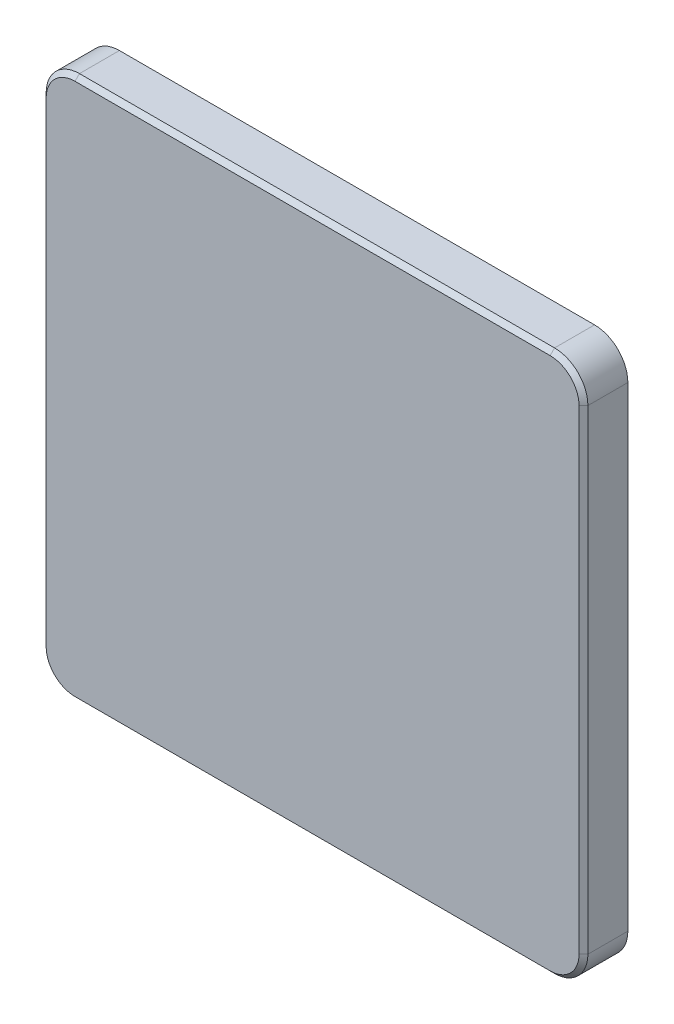
ISO-10303-21;
HEADER;
FILE_DESCRIPTION(('STEP AP214'),'2;1');
FILE_NAME('part.step','',(''),(''),'','','');
FILE_SCHEMA(('AUTOMOTIVE_DESIGN { 1 0 10303 214 1 1 1 1 }'));
ENDSEC;
DATA;
#1=APPLICATION_CONTEXT('core data for automotive mechanical design processes');
#2=APPLICATION_PROTOCOL_DEFINITION('international standard','automotive_design',2000,#1);
#3=PRODUCT_CONTEXT('',#1,'mechanical');
#4=PRODUCT('Part','Part','',(#3));
#5=PRODUCT_RELATED_PRODUCT_CATEGORY('part','',(#4));
#6=PRODUCT_DEFINITION_FORMATION('','',#4);
#7=PRODUCT_DEFINITION_CONTEXT('part definition',#1,'design');
#8=PRODUCT_DEFINITION('design','',#6,#7);
#9=PRODUCT_DEFINITION_SHAPE('','',#8);
#10=(LENGTH_UNIT() NAMED_UNIT(*) SI_UNIT(.MILLI.,.METRE.));
#11=(NAMED_UNIT(*) PLANE_ANGLE_UNIT() SI_UNIT($,.RADIAN.));
#12=(NAMED_UNIT(*) SI_UNIT($,.STERADIAN.) SOLID_ANGLE_UNIT());
#13=UNCERTAINTY_MEASURE_WITH_UNIT(LENGTH_MEASURE(1.E-05),#10,'distance_accuracy_value','');
#14=(GEOMETRIC_REPRESENTATION_CONTEXT(3) GLOBAL_UNCERTAINTY_ASSIGNED_CONTEXT((#13)) GLOBAL_UNIT_ASSIGNED_CONTEXT((#10,
#11,#12)) REPRESENTATION_CONTEXT('',''));
#15=CARTESIAN_POINT('',(0.,0.,0.));
#16=DIRECTION('',(0.,0.,1.));
#17=DIRECTION('',(1.,0.,0.));
#18=AXIS2_PLACEMENT_3D('',#15,#16,#17);
#19=CARTESIAN_POINT('',(2.7178,2.7178,-0.0253999999999999));
#20=DIRECTION('',(0.,0.,-1.));
#21=DIRECTION('',(0.,1.,0.));
#22=AXIS2_PLACEMENT_3D('',#19,#20,#21);
#23=CONICAL_SURFACE('',#22,0.3556,0.785398163400003);
#24=DIRECTION('',(0.,-0.707106781186551,0.707106781186544));
#25=VECTOR('',#24,1.);
#26=CARTESIAN_POINT('',(2.7178,3.0988,-0.0507999999999998));
#27=LINE('',#26,#25);
#28=CARTESIAN_POINT('',(2.7178,3.0988,-0.0507999999999998));
#29=VERTEX_POINT('',#28);
#30=CARTESIAN_POINT('',(2.7178,3.048,0.));
#31=VERTEX_POINT('',#30);
#32=EDGE_CURVE('E11',#29,#31,#27,.T.);
#33=ORIENTED_EDGE('',*,*,#32,.T.);
#34=CARTESIAN_POINT('',(2.7178,2.7178,0.));
#35=DIRECTION('',(0.,0.,-1.));
#36=DIRECTION('',(0.,1.,0.));
#37=AXIS2_PLACEMENT_3D('',#34,#35,#36);
#38=CIRCLE('',#37,0.3302);
#39=CARTESIAN_POINT('',(3.048,2.7178,0.));
#40=VERTEX_POINT('',#39);
#41=EDGE_CURVE('E24',#31,#40,#38,.T.);
#42=ORIENTED_EDGE('',*,*,#41,.T.);
#43=DIRECTION('',(0.707106781186551,0.,-0.707106781186544));
#44=VECTOR('',#43,1.);
#45=CARTESIAN_POINT('',(3.048,2.7178,0.));
#46=LINE('',#45,#44);
#47=CARTESIAN_POINT('',(3.0988,2.7178,-0.0507999999999998));
#48=VERTEX_POINT('',#47);
#49=EDGE_CURVE('E205',#40,#48,#46,.T.);
#50=ORIENTED_EDGE('',*,*,#49,.T.);
#51=CARTESIAN_POINT('',(2.7178,2.7178,-0.0507999999999998));
#52=DIRECTION('',(0.,0.,1.));
#53=DIRECTION('',(0.,1.,0.));
#54=AXIS2_PLACEMENT_3D('',#51,#52,#53);
#55=CIRCLE('',#54,0.381);
#56=EDGE_CURVE('E203',#48,#29,#55,.T.);
#57=ORIENTED_EDGE('',*,*,#56,.T.);
#58=EDGE_LOOP('',(#33,#42,#50,#57));
#59=FACE_BOUND('',#58,.T.);
#60=ADVANCED_FACE('F17',(#59),#23,.T.);
#61=CARTESIAN_POINT('',(1.5494,3.0734,-0.0254));
#62=DIRECTION('',(0.,0.707106781186549,0.707106781186546));
#63=DIRECTION('',(1.,0.,0.));
#64=AXIS2_PLACEMENT_3D('',#61,#62,#63);
#65=PLANE('',#64);
#66=ORIENTED_EDGE('',*,*,#32,.F.);
#67=DIRECTION('',(-1.,0.,0.));
#68=VECTOR('',#67,1.);
#69=CARTESIAN_POINT('',(1.5494,3.0988,-0.0508));
#70=LINE('',#69,#68);
#71=CARTESIAN_POINT('',(-2.7178,3.0988,-0.0508));
#72=VERTEX_POINT('',#71);
#73=EDGE_CURVE('E201',#29,#72,#70,.T.);
#74=ORIENTED_EDGE('',*,*,#73,.T.);
#75=DIRECTION('',(0.,-0.707106781186546,0.707106781186549));
#76=VECTOR('',#75,1.);
#77=CARTESIAN_POINT('',(-2.7178,3.0988,-0.0508));
#78=LINE('',#77,#76);
#79=CARTESIAN_POINT('',(-2.7178,3.048,0.));
#80=VERTEX_POINT('',#79);
#81=EDGE_CURVE('E199',#72,#80,#78,.T.);
#82=ORIENTED_EDGE('',*,*,#81,.T.);
#83=DIRECTION('',(1.,0.,0.));
#84=VECTOR('',#83,1.);
#85=CARTESIAN_POINT('',(1.5494,3.048,0.));
#86=LINE('',#85,#84);
#87=EDGE_CURVE('E197',#80,#31,#86,.T.);
#88=ORIENTED_EDGE('',*,*,#87,.T.);
#89=EDGE_LOOP('',(#66,#74,#82,#88));
#90=FACE_BOUND('',#89,.T.);
#91=ADVANCED_FACE('F240',(#90),#65,.T.);
#92=CARTESIAN_POINT('',(-2.7178,2.7178,-0.0253999999999999));
#93=DIRECTION('',(0.,0.,-1.));
#94=DIRECTION('',(-1.,0.,0.));
#95=AXIS2_PLACEMENT_3D('',#92,#93,#94);
#96=CONICAL_SURFACE('',#95,0.3556,0.785398163400003);
#97=DIRECTION('',(0.707106781186551,0.,0.707106781186544));
#98=VECTOR('',#97,1.);
#99=CARTESIAN_POINT('',(-3.0988,2.7178,-0.0507999999999998));
#100=LINE('',#99,#98);
#101=CARTESIAN_POINT('',(-3.0988,2.7178,-0.0507999999999998));
#102=VERTEX_POINT('',#101);
#103=CARTESIAN_POINT('',(-3.048,2.7178,0.));
#104=VERTEX_POINT('',#103);
#105=EDGE_CURVE('E195',#102,#104,#100,.T.);
#106=ORIENTED_EDGE('',*,*,#105,.T.);
#107=CARTESIAN_POINT('',(-2.7178,2.7178,0.));
#108=DIRECTION('',(0.,0.,-1.));
#109=DIRECTION('',(-1.,0.,0.));
#110=AXIS2_PLACEMENT_3D('',#107,#108,#109);
#111=CIRCLE('',#110,0.3302);
#112=EDGE_CURVE('E192',#104,#80,#111,.T.);
#113=ORIENTED_EDGE('',*,*,#112,.T.);
#114=ORIENTED_EDGE('',*,*,#81,.F.);
#115=CARTESIAN_POINT('',(-2.7178,2.7178,-0.0507999999999998));
#116=DIRECTION('',(0.,0.,1.));
#117=DIRECTION('',(-1.,0.,0.));
#118=AXIS2_PLACEMENT_3D('',#115,#116,#117);
#119=CIRCLE('',#118,0.381);
#120=EDGE_CURVE('E189',#72,#102,#119,.T.);
#121=ORIENTED_EDGE('',*,*,#120,.T.);
#122=EDGE_LOOP('',(#106,#113,#114,#121));
#123=FACE_BOUND('',#122,.T.);
#124=ADVANCED_FACE('F243',(#123),#96,.T.);
#125=CARTESIAN_POINT('',(-3.0734,1.5494,-0.0254));
#126=DIRECTION('',(-0.707106781186549,0.,0.707106781186546));
#127=DIRECTION('',(0.707106781186546,0.,0.707106781186549));
#128=AXIS2_PLACEMENT_3D('',#125,#126,#127);
#129=PLANE('',#128);
#130=ORIENTED_EDGE('',*,*,#105,.F.);
#131=DIRECTION('',(0.,-1.,0.));
#132=VECTOR('',#131,1.);
#133=CARTESIAN_POINT('',(-3.0988,1.5494,-0.0508));
#134=LINE('',#133,#132);
#135=CARTESIAN_POINT('',(-3.0988,-2.7178,-0.0508));
#136=VERTEX_POINT('',#135);
#137=EDGE_CURVE('E187',#102,#136,#134,.T.);
#138=ORIENTED_EDGE('',*,*,#137,.T.);
#139=DIRECTION('',(0.707106781186546,0.,0.707106781186549));
#140=VECTOR('',#139,1.);
#141=CARTESIAN_POINT('',(-3.0988,-2.7178,-0.0508));
#142=LINE('',#141,#140);
#143=CARTESIAN_POINT('',(-3.048,-2.7178,0.));
#144=VERTEX_POINT('',#143);
#145=EDGE_CURVE('E185',#136,#144,#142,.T.);
#146=ORIENTED_EDGE('',*,*,#145,.T.);
#147=DIRECTION('',(0.,1.,0.));
#148=VECTOR('',#147,1.);
#149=CARTESIAN_POINT('',(-3.048,1.5494,0.));
#150=LINE('',#149,#148);
#151=EDGE_CURVE('E182',#144,#104,#150,.T.);
#152=ORIENTED_EDGE('',*,*,#151,.T.);
#153=EDGE_LOOP('',(#130,#138,#146,#152));
#154=FACE_BOUND('',#153,.T.);
#155=ADVANCED_FACE('F254',(#154),#129,.T.);
#156=CARTESIAN_POINT('',(-2.7178,-2.7178,-0.0253999999999999));
#157=DIRECTION('',(0.,0.,-1.));
#158=DIRECTION('',(0.,-1.,0.));
#159=AXIS2_PLACEMENT_3D('',#156,#157,#158);
#160=CONICAL_SURFACE('',#159,0.3556,0.785398163400003);
#161=DIRECTION('',(0.,0.707106781186551,0.707106781186544));
#162=VECTOR('',#161,1.);
#163=CARTESIAN_POINT('',(-2.7178,-3.0988,-0.0507999999999998));
#164=LINE('',#163,#162);
#165=CARTESIAN_POINT('',(-2.7178,-3.0988,-0.0507999999999998));
#166=VERTEX_POINT('',#165);
#167=CARTESIAN_POINT('',(-2.7178,-3.048,0.));
#168=VERTEX_POINT('',#167);
#169=EDGE_CURVE('E180',#166,#168,#164,.T.);
#170=ORIENTED_EDGE('',*,*,#169,.T.);
#171=CARTESIAN_POINT('',(-2.7178,-2.7178,0.));
#172=DIRECTION('',(0.,0.,-1.));
#173=DIRECTION('',(0.,-1.,0.));
#174=AXIS2_PLACEMENT_3D('',#171,#172,#173);
#175=CIRCLE('',#174,0.3302);
#176=EDGE_CURVE('E177',#168,#144,#175,.T.);
#177=ORIENTED_EDGE('',*,*,#176,.T.);
#178=ORIENTED_EDGE('',*,*,#145,.F.);
#179=CARTESIAN_POINT('',(-2.7178,-2.7178,-0.0507999999999998));
#180=DIRECTION('',(0.,0.,1.));
#181=DIRECTION('',(0.,-1.,0.));
#182=AXIS2_PLACEMENT_3D('',#179,#180,#181);
#183=CIRCLE('',#182,0.381);
#184=EDGE_CURVE('E174',#136,#166,#183,.T.);
#185=ORIENTED_EDGE('',*,*,#184,.T.);
#186=EDGE_LOOP('',(#170,#177,#178,#185));
#187=FACE_BOUND('',#186,.T.);
#188=ADVANCED_FACE('F257',(#187),#160,.T.);
#189=CARTESIAN_POINT('',(-1.5494,-3.0734,-0.0254));
#190=DIRECTION('',(0.,-0.707106781186549,0.707106781186546));
#191=DIRECTION('',(1.,0.,0.));
#192=AXIS2_PLACEMENT_3D('',#189,#190,#191);
#193=PLANE('',#192);
#194=ORIENTED_EDGE('',*,*,#169,.F.);
#195=DIRECTION('',(1.,0.,0.));
#196=VECTOR('',#195,1.);
#197=CARTESIAN_POINT('',(-1.5494,-3.0988,-0.0508));
#198=LINE('',#197,#196);
#199=CARTESIAN_POINT('',(2.7178,-3.0988,-0.0508));
#200=VERTEX_POINT('',#199);
#201=EDGE_CURVE('E125',#166,#200,#198,.T.);
#202=ORIENTED_EDGE('',*,*,#201,.T.);
#203=DIRECTION('',(0.,0.707106781186546,0.707106781186549));
#204=VECTOR('',#203,1.);
#205=CARTESIAN_POINT('',(2.7178,-3.0988,-0.0508));
#206=LINE('',#205,#204);
#207=CARTESIAN_POINT('',(2.7178,-3.048,0.));
#208=VERTEX_POINT('',#207);
#209=EDGE_CURVE('E171',#200,#208,#206,.T.);
#210=ORIENTED_EDGE('',*,*,#209,.T.);
#211=DIRECTION('',(-1.,0.,0.));
#212=VECTOR('',#211,1.);
#213=CARTESIAN_POINT('',(-1.5494,-3.048,0.));
#214=LINE('',#213,#212);
#215=EDGE_CURVE('E168',#208,#168,#214,.T.);
#216=ORIENTED_EDGE('',*,*,#215,.T.);
#217=EDGE_LOOP('',(#194,#202,#210,#216));
#218=FACE_BOUND('',#217,.T.);
#219=ADVANCED_FACE('F259',(#218),#193,.T.);
#220=CARTESIAN_POINT('',(2.7178,-2.7178,-0.0253999999999999));
#221=DIRECTION('',(0.,0.,-1.));
#222=DIRECTION('',(1.,0.,0.));
#223=AXIS2_PLACEMENT_3D('',#220,#221,#222);
#224=CONICAL_SURFACE('',#223,0.3556,0.785398163400003);
#225=DIRECTION('',(-0.707106781186551,0.,0.707106781186544));
#226=VECTOR('',#225,1.);
#227=CARTESIAN_POINT('',(3.0988,-2.7178,-0.0507999999999998));
#228=LINE('',#227,#226);
#229=CARTESIAN_POINT('',(3.0988,-2.7178,-0.0507999999999998));
#230=VERTEX_POINT('',#229);
#231=CARTESIAN_POINT('',(3.048,-2.7178,0.));
#232=VERTEX_POINT('',#231);
#233=EDGE_CURVE('E166',#230,#232,#228,.T.);
#234=ORIENTED_EDGE('',*,*,#233,.T.);
#235=CARTESIAN_POINT('',(2.7178,-2.7178,0.));
#236=DIRECTION('',(0.,0.,-1.));
#237=DIRECTION('',(1.,0.,0.));
#238=AXIS2_PLACEMENT_3D('',#235,#236,#237);
#239=CIRCLE('',#238,0.3302);
#240=EDGE_CURVE('E163',#232,#208,#239,.T.);
#241=ORIENTED_EDGE('',*,*,#240,.T.);
#242=ORIENTED_EDGE('',*,*,#209,.F.);
#243=CARTESIAN_POINT('',(2.7178,-2.7178,-0.0507999999999998));
#244=DIRECTION('',(0.,0.,1.));
#245=DIRECTION('',(1.,0.,0.));
#246=AXIS2_PLACEMENT_3D('',#243,#244,#245);
#247=CIRCLE('',#246,0.381);
#248=EDGE_CURVE('E160',#200,#230,#247,.T.);
#249=ORIENTED_EDGE('',*,*,#248,.T.);
#250=EDGE_LOOP('',(#234,#241,#242,#249));
#251=FACE_BOUND('',#250,.T.);
#252=ADVANCED_FACE('F221',(#251),#224,.T.);
#253=CARTESIAN_POINT('',(3.0734,-1.5494,-0.0254));
#254=DIRECTION('',(0.707106781186549,0.,0.707106781186546));
#255=DIRECTION('',(0.707106781186546,0.,-0.707106781186549));
#256=AXIS2_PLACEMENT_3D('',#253,#254,#255);
#257=PLANE('',#256);
#258=ORIENTED_EDGE('',*,*,#233,.F.);
#259=DIRECTION('',(0.,1.,0.));
#260=VECTOR('',#259,1.);
#261=CARTESIAN_POINT('',(3.0988,-1.5494,-0.0508));
#262=LINE('',#261,#260);
#263=EDGE_CURVE('E157',#230,#48,#262,.T.);
#264=ORIENTED_EDGE('',*,*,#263,.T.);
#265=ORIENTED_EDGE('',*,*,#49,.F.);
#266=DIRECTION('',(0.,-1.,0.));
#267=VECTOR('',#266,1.);
#268=CARTESIAN_POINT('',(3.048,-1.5494,0.));
#269=LINE('',#268,#267);
#270=EDGE_CURVE('E154',#40,#232,#269,.T.);
#271=ORIENTED_EDGE('',*,*,#270,.T.);
#272=EDGE_LOOP('',(#258,#264,#265,#271));
#273=FACE_BOUND('',#272,.T.);
#274=ADVANCED_FACE('F212',(#273),#257,.T.);
#275=CARTESIAN_POINT('',(-3.0988,3.0988,0.));
#276=DIRECTION('',(-1.,0.,0.));
#277=DIRECTION('',(0.,-1.,0.));
#278=AXIS2_PLACEMENT_3D('',#275,#276,#277);
#279=PLANE('',#278);
#280=ORIENTED_EDGE('',*,*,#137,.F.);
#281=DIRECTION('',(0.,0.,-1.));
#282=VECTOR('',#281,1.);
#283=CARTESIAN_POINT('',(-3.0988,2.7178,0.));
#284=LINE('',#283,#282);
#285=CARTESIAN_POINT('',(-3.0988,2.7178,-0.508));
#286=VERTEX_POINT('',#285);
#287=EDGE_CURVE('E152',#102,#286,#284,.T.);
#288=ORIENTED_EDGE('',*,*,#287,.T.);
#289=DIRECTION('',(0.,1.,0.));
#290=VECTOR('',#289,1.);
#291=CARTESIAN_POINT('',(-3.0988,1.6082163948911,-0.508));
#292=LINE('',#291,#290);
#293=CARTESIAN_POINT('',(-3.0988,-2.7178,-0.508));
#294=VERTEX_POINT('',#293);
#295=EDGE_CURVE('E150',#294,#286,#292,.T.);
#296=ORIENTED_EDGE('',*,*,#295,.F.);
#297=DIRECTION('',(0.,0.,-1.));
#298=VECTOR('',#297,1.);
#299=CARTESIAN_POINT('',(-3.0988,-2.7178,0.));
#300=LINE('',#299,#298);
#301=EDGE_CURVE('E120',#136,#294,#300,.T.);
#302=ORIENTED_EDGE('',*,*,#301,.F.);
#303=EDGE_LOOP('',(#280,#288,#296,#302));
#304=FACE_BOUND('',#303,.T.);
#305=ADVANCED_FACE('F251',(#304),#279,.T.);
#306=CARTESIAN_POINT('',(-2.7178,2.7178,25.8741561999999));
#307=DIRECTION('',(0.,0.,-1.));
#308=DIRECTION('',(-1.,0.,0.));
#309=AXIS2_PLACEMENT_3D('',#306,#307,#308);
#310=CYLINDRICAL_SURFACE('',#309,0.381);
#311=ORIENTED_EDGE('',*,*,#120,.F.);
#312=DIRECTION('',(0.,0.,-1.));
#313=VECTOR('',#312,1.);
#314=CARTESIAN_POINT('',(-2.7178,3.0988,0.));
#315=LINE('',#314,#313);
#316=CARTESIAN_POINT('',(-2.7178,3.0988,-0.508));
#317=VERTEX_POINT('',#316);
#318=EDGE_CURVE('E147',#72,#317,#315,.T.);
#319=ORIENTED_EDGE('',*,*,#318,.T.);
#320=CARTESIAN_POINT('',(-2.7178,2.7178,-0.508000000000003));
#321=DIRECTION('',(0.,0.,-1.));
#322=DIRECTION('',(-1.,0.,0.));
#323=AXIS2_PLACEMENT_3D('',#320,#321,#322);
#324=CIRCLE('',#323,0.381);
#325=EDGE_CURVE('E144',#286,#317,#324,.T.);
#326=ORIENTED_EDGE('',*,*,#325,.F.);
#327=ORIENTED_EDGE('',*,*,#287,.F.);
#328=EDGE_LOOP('',(#311,#319,#326,#327));
#329=FACE_BOUND('',#328,.T.);
#330=ADVANCED_FACE('F248',(#329),#310,.T.);
#331=CARTESIAN_POINT('',(3.0988,3.0988,0.));
#332=DIRECTION('',(0.,1.,0.));
#333=DIRECTION('',(-1.,0.,0.));
#334=AXIS2_PLACEMENT_3D('',#331,#332,#333);
#335=PLANE('',#334);
#336=ORIENTED_EDGE('',*,*,#73,.F.);
#337=DIRECTION('',(0.,0.,-1.));
#338=VECTOR('',#337,1.);
#339=CARTESIAN_POINT('',(2.7178,3.0988,0.));
#340=LINE('',#339,#338);
#341=CARTESIAN_POINT('',(2.7178,3.0988,-0.508));
#342=VERTEX_POINT('',#341);
#343=EDGE_CURVE('E142',#29,#342,#340,.T.);
#344=ORIENTED_EDGE('',*,*,#343,.T.);
#345=DIRECTION('',(1.,0.,0.));
#346=VECTOR('',#345,1.);
#347=CARTESIAN_POINT('',(1.5494,3.0988,-0.508));
#348=LINE('',#347,#346);
#349=EDGE_CURVE('E139',#317,#342,#348,.T.);
#350=ORIENTED_EDGE('',*,*,#349,.F.);
#351=ORIENTED_EDGE('',*,*,#318,.F.);
#352=EDGE_LOOP('',(#336,#344,#350,#351));
#353=FACE_BOUND('',#352,.T.);
#354=ADVANCED_FACE('F238',(#353),#335,.T.);
#355=CARTESIAN_POINT('',(2.7178,2.7178,25.8741561999999));
#356=DIRECTION('',(0.,0.,-1.));
#357=DIRECTION('',(0.,1.,0.));
#358=AXIS2_PLACEMENT_3D('',#355,#356,#357);
#359=CYLINDRICAL_SURFACE('',#358,0.381);
#360=ORIENTED_EDGE('',*,*,#56,.F.);
#361=DIRECTION('',(0.,0.,-1.));
#362=VECTOR('',#361,1.);
#363=CARTESIAN_POINT('',(3.0988,2.7178,0.));
#364=LINE('',#363,#362);
#365=CARTESIAN_POINT('',(3.0988,2.7178,-0.508));
#366=VERTEX_POINT('',#365);
#367=EDGE_CURVE('E137',#48,#366,#364,.T.);
#368=ORIENTED_EDGE('',*,*,#367,.T.);
#369=CARTESIAN_POINT('',(2.7178,2.7178,-0.508000000000003));
#370=DIRECTION('',(0.,0.,-1.));
#371=DIRECTION('',(0.,1.,0.));
#372=AXIS2_PLACEMENT_3D('',#369,#370,#371);
#373=CIRCLE('',#372,0.381);
#374=EDGE_CURVE('E134',#342,#366,#373,.T.);
#375=ORIENTED_EDGE('',*,*,#374,.F.);
#376=ORIENTED_EDGE('',*,*,#343,.F.);
#377=EDGE_LOOP('',(#360,#368,#375,#376));
#378=FACE_BOUND('',#377,.T.);
#379=ADVANCED_FACE('F234',(#378),#359,.T.);
#380=CARTESIAN_POINT('',(0.,0.,0.));
#381=DIRECTION('',(0.,0.,1.));
#382=DIRECTION('',(1.,0.,0.));
#383=AXIS2_PLACEMENT_3D('',#380,#381,#382);
#384=PLANE('',#383);
#385=ORIENTED_EDGE('',*,*,#41,.F.);
#386=ORIENTED_EDGE('',*,*,#87,.F.);
#387=ORIENTED_EDGE('',*,*,#112,.F.);
#388=ORIENTED_EDGE('',*,*,#151,.F.);
#389=ORIENTED_EDGE('',*,*,#176,.F.);
#390=ORIENTED_EDGE('',*,*,#215,.F.);
#391=ORIENTED_EDGE('',*,*,#240,.F.);
#392=ORIENTED_EDGE('',*,*,#270,.F.);
#393=EDGE_LOOP('',(#385,#386,#387,#388,#389,#390,#391,#392));
#394=FACE_BOUND('',#393,.T.);
#395=ADVANCED_FACE('F216',(#394),#384,.T.);
#396=CARTESIAN_POINT('',(0.,0.117632789782286,-0.508));
#397=DIRECTION('',(0.,0.,-1.));
#398=DIRECTION('',(-1.,0.,0.));
#399=AXIS2_PLACEMENT_3D('',#396,#397,#398);
#400=PLANE('',#399);
#401=CARTESIAN_POINT('',(2.7178,-2.7178,-0.508000000000003));
#402=DIRECTION('',(0.,0.,-1.));
#403=DIRECTION('',(1.,0.,0.));
#404=AXIS2_PLACEMENT_3D('',#401,#402,#403);
#405=CIRCLE('',#404,0.381);
#406=CARTESIAN_POINT('',(3.0988,-2.7178,-0.508));
#407=VERTEX_POINT('',#406);
#408=CARTESIAN_POINT('',(2.7178,-3.0988,-0.508));
#409=VERTEX_POINT('',#408);
#410=EDGE_CURVE('E107',#407,#409,#405,.T.);
#411=ORIENTED_EDGE('',*,*,#410,.T.);
#412=DIRECTION('',(-1.,0.,0.));
#413=VECTOR('',#412,1.);
#414=CARTESIAN_POINT('',(-1.5494,-3.0988,-0.508));
#415=LINE('',#414,#413);
#416=CARTESIAN_POINT('',(-2.7178,-3.0988,-0.508));
#417=VERTEX_POINT('',#416);
#418=EDGE_CURVE('E101',#409,#417,#415,.T.);
#419=ORIENTED_EDGE('',*,*,#418,.T.);
#420=CARTESIAN_POINT('',(-2.7178,-2.7178,-0.508000000000003));
#421=DIRECTION('',(0.,0.,-1.));
#422=DIRECTION('',(0.,-1.,0.));
#423=AXIS2_PLACEMENT_3D('',#420,#421,#422);
#424=CIRCLE('',#423,0.381);
#425=EDGE_CURVE('E105',#417,#294,#424,.T.);
#426=ORIENTED_EDGE('',*,*,#425,.T.);
#427=ORIENTED_EDGE('',*,*,#295,.T.);
#428=ORIENTED_EDGE('',*,*,#325,.T.);
#429=ORIENTED_EDGE('',*,*,#349,.T.);
#430=ORIENTED_EDGE('',*,*,#374,.T.);
#431=DIRECTION('',(0.,-1.,0.));
#432=VECTOR('',#431,1.);
#433=CARTESIAN_POINT('',(3.0988,-1.4905836051089,-0.508));
#434=LINE('',#433,#432);
#435=EDGE_CURVE('E121',#366,#407,#434,.T.);
#436=ORIENTED_EDGE('',*,*,#435,.T.);
#437=EDGE_LOOP('',(#411,#419,#426,#427,#428,#429,#430,#436));
#438=FACE_BOUND('',#437,.T.);
#439=ADVANCED_FACE('F103',(#438),#400,.T.);
#440=CARTESIAN_POINT('',(-2.7178,-2.7178,25.8741561999999));
#441=DIRECTION('',(0.,0.,-1.));
#442=DIRECTION('',(0.,-1.,0.));
#443=AXIS2_PLACEMENT_3D('',#440,#441,#442);
#444=CYLINDRICAL_SURFACE('',#443,0.381);
#445=ORIENTED_EDGE('',*,*,#184,.F.);
#446=ORIENTED_EDGE('',*,*,#301,.T.);
#447=ORIENTED_EDGE('',*,*,#425,.F.);
#448=DIRECTION('',(0.,0.,-1.));
#449=VECTOR('',#448,1.);
#450=CARTESIAN_POINT('',(-2.7178,-3.0988,0.));
#451=LINE('',#450,#449);
#452=EDGE_CURVE('E118',#166,#417,#451,.T.);
#453=ORIENTED_EDGE('',*,*,#452,.F.);
#454=EDGE_LOOP('',(#445,#446,#447,#453));
#455=FACE_BOUND('',#454,.T.);
#456=ADVANCED_FACE('F117',(#455),#444,.T.);
#457=CARTESIAN_POINT('',(-3.0988,-3.0988,0.));
#458=DIRECTION('',(0.,-1.,0.));
#459=DIRECTION('',(1.,0.,0.));
#460=AXIS2_PLACEMENT_3D('',#457,#458,#459);
#461=PLANE('',#460);
#462=ORIENTED_EDGE('',*,*,#201,.F.);
#463=ORIENTED_EDGE('',*,*,#452,.T.);
#464=ORIENTED_EDGE('',*,*,#418,.F.);
#465=DIRECTION('',(0.,0.,-1.));
#466=VECTOR('',#465,1.);
#467=CARTESIAN_POINT('',(2.7178,-3.0988,0.));
#468=LINE('',#467,#466);
#469=EDGE_CURVE('E126',#200,#409,#468,.T.);
#470=ORIENTED_EDGE('',*,*,#469,.F.);
#471=EDGE_LOOP('',(#462,#463,#464,#470));
#472=FACE_BOUND('',#471,.T.);
#473=ADVANCED_FACE('F124',(#472),#461,.T.);
#474=CARTESIAN_POINT('',(2.7178,-2.7178,25.8741561999999));
#475=DIRECTION('',(0.,0.,-1.));
#476=DIRECTION('',(1.,0.,0.));
#477=AXIS2_PLACEMENT_3D('',#474,#475,#476);
#478=CYLINDRICAL_SURFACE('',#477,0.381);
#479=ORIENTED_EDGE('',*,*,#248,.F.);
#480=ORIENTED_EDGE('',*,*,#469,.T.);
#481=ORIENTED_EDGE('',*,*,#410,.F.);
#482=DIRECTION('',(0.,0.,-1.));
#483=VECTOR('',#482,1.);
#484=CARTESIAN_POINT('',(3.0988,-2.7178,0.));
#485=LINE('',#484,#483);
#486=EDGE_CURVE('E129',#230,#407,#485,.T.);
#487=ORIENTED_EDGE('',*,*,#486,.F.);
#488=EDGE_LOOP('',(#479,#480,#481,#487));
#489=FACE_BOUND('',#488,.T.);
#490=ADVANCED_FACE('F229',(#489),#478,.T.);
#491=CARTESIAN_POINT('',(3.0988,-3.0988,0.));
#492=DIRECTION('',(1.,0.,0.));
#493=DIRECTION('',(0.,1.,0.));
#494=AXIS2_PLACEMENT_3D('',#491,#492,#493);
#495=PLANE('',#494);
#496=ORIENTED_EDGE('',*,*,#263,.F.);
#497=ORIENTED_EDGE('',*,*,#486,.T.);
#498=ORIENTED_EDGE('',*,*,#435,.F.);
#499=ORIENTED_EDGE('',*,*,#367,.F.);
#500=EDGE_LOOP('',(#496,#497,#498,#499));
#501=FACE_BOUND('',#500,.T.);
#502=ADVANCED_FACE('F227',(#501),#495,.T.);
#503=CLOSED_SHELL('',(#60,#91,#124,#155,#188,#219,#252,#274,#305,#330,#354,#379,#395,#439,#456,
#473,#490,#502));
#504=MANIFOLD_SOLID_BREP('B1',#503);
#505=ADVANCED_BREP_SHAPE_REPRESENTATION('',(#18,#504),#14);
#506=SHAPE_DEFINITION_REPRESENTATION(#9,#505);
ENDSEC;
END-ISO-10303-21;
